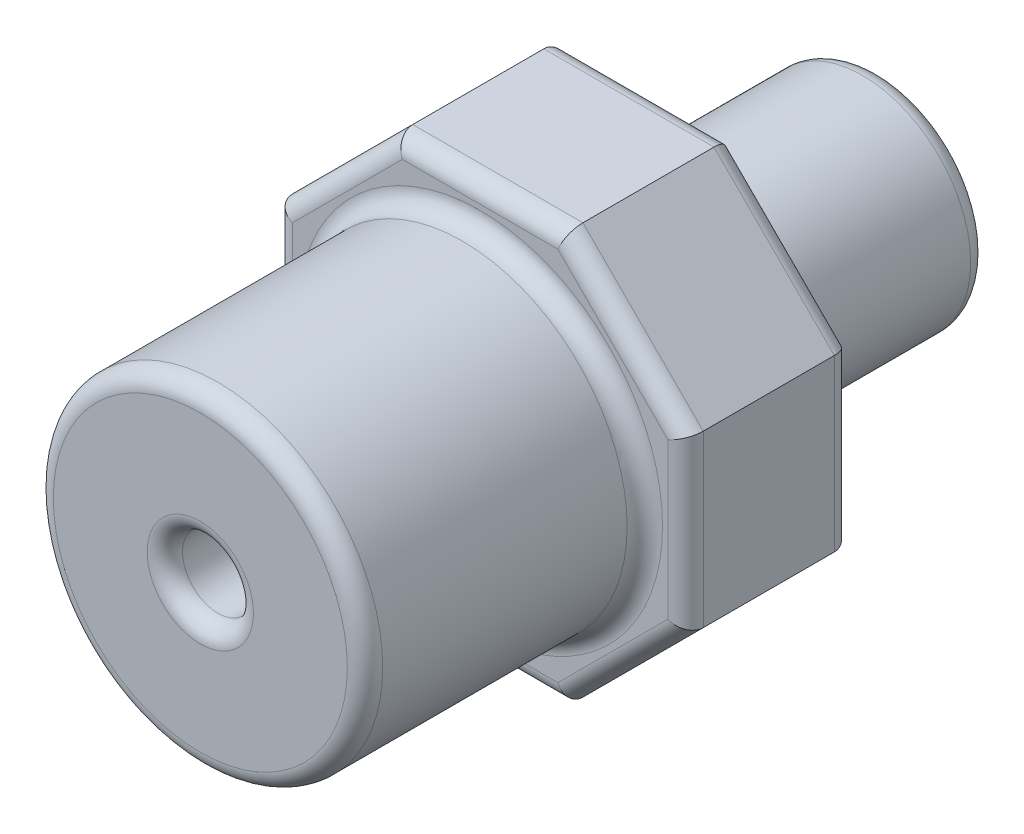
ISO-10303-21;
HEADER;
FILE_DESCRIPTION(('STEP AP214'),'2;1');
FILE_NAME('part.step','',(''),(''),'','','');
FILE_SCHEMA(('AUTOMOTIVE_DESIGN { 1 0 10303 214 1 1 1 1 }'));
ENDSEC;
DATA;
#1=APPLICATION_CONTEXT('core data for automotive mechanical design processes');
#2=APPLICATION_PROTOCOL_DEFINITION('international standard','automotive_design',2000,#1);
#3=PRODUCT_CONTEXT('',#1,'mechanical');
#4=PRODUCT('Part','Part','',(#3));
#5=PRODUCT_RELATED_PRODUCT_CATEGORY('part','',(#4));
#6=PRODUCT_DEFINITION_FORMATION('','',#4);
#7=PRODUCT_DEFINITION_CONTEXT('part definition',#1,'design');
#8=PRODUCT_DEFINITION('design','',#6,#7);
#9=PRODUCT_DEFINITION_SHAPE('','',#8);
#10=(LENGTH_UNIT() NAMED_UNIT(*) SI_UNIT(.MILLI.,.METRE.));
#11=(NAMED_UNIT(*) PLANE_ANGLE_UNIT() SI_UNIT($,.RADIAN.));
#12=(NAMED_UNIT(*) SI_UNIT($,.STERADIAN.) SOLID_ANGLE_UNIT());
#13=UNCERTAINTY_MEASURE_WITH_UNIT(LENGTH_MEASURE(1.E-05),#10,'distance_accuracy_value','');
#14=(GEOMETRIC_REPRESENTATION_CONTEXT(3) GLOBAL_UNCERTAINTY_ASSIGNED_CONTEXT((#13)) GLOBAL_UNIT_ASSIGNED_CONTEXT((#10,
#11,#12)) REPRESENTATION_CONTEXT('',''));
#15=CARTESIAN_POINT('',(0.,0.,0.));
#16=DIRECTION('',(0.,0.,1.));
#17=DIRECTION('',(1.,0.,0.));
#18=AXIS2_PLACEMENT_3D('',#15,#16,#17);
#19=CARTESIAN_POINT('',(0.,0.,0.));
#20=DIRECTION('',(0.,0.,1.));
#21=DIRECTION('',(1.,0.,0.));
#22=AXIS2_PLACEMENT_3D('',#19,#20,#21);
#23=PLANE('',#22);
#24=CARTESIAN_POINT('',(0.,0.,0.));
#25=DIRECTION('',(0.,0.,1.));
#26=DIRECTION('',(1.,0.,0.));
#27=AXIS2_PLACEMENT_3D('',#24,#25,#26);
#28=CIRCLE('',#27,1.5);
#29=CARTESIAN_POINT('',(1.5,0.,0.));
#30=VERTEX_POINT('',#29);
#31=EDGE_CURVE('E273',#30,#30,#28,.T.);
#32=ORIENTED_EDGE('',*,*,#31,.T.);
#33=EDGE_LOOP('',(#32));
#34=FACE_BOUND('',#33,.T.);
#35=CARTESIAN_POINT('',(0.,0.,0.));
#36=DIRECTION('',(0.,0.,1.));
#37=DIRECTION('',(1.,0.,0.));
#38=AXIS2_PLACEMENT_3D('',#35,#36,#37);
#39=CIRCLE('',#38,2.55);
#40=CARTESIAN_POINT('',(2.55,0.,0.));
#41=VERTEX_POINT('',#40);
#42=EDGE_CURVE('E269',#41,#41,#39,.F.);
#43=ORIENTED_EDGE('',*,*,#42,.T.);
#44=EDGE_LOOP('',(#43));
#45=FACE_BOUND('',#44,.T.);
#46=ADVANCED_FACE('F43',(#34,#45),#23,.F.);
#47=CARTESIAN_POINT('',(0.,0.,6.6));
#48=DIRECTION('',(0.,0.,-1.));
#49=DIRECTION('',(-1.,0.,0.));
#50=AXIS2_PLACEMENT_3D('',#47,#48,#49);
#51=CYLINDRICAL_SURFACE('',#50,3.05);
#52=CARTESIAN_POINT('',(0.,0.,0.5));
#53=DIRECTION('',(0.,0.,1.));
#54=DIRECTION('',(1.,0.,0.));
#55=AXIS2_PLACEMENT_3D('',#52,#53,#54);
#56=CIRCLE('',#55,3.05);
#57=CARTESIAN_POINT('',(3.05,0.,0.5));
#58=VERTEX_POINT('',#57);
#59=EDGE_CURVE('E11',#58,#58,#56,.T.);
#60=ORIENTED_EDGE('',*,*,#59,.T.);
#61=EDGE_LOOP('',(#60));
#62=FACE_BOUND('',#61,.T.);
#63=CARTESIAN_POINT('',(0.,0.,6.1));
#64=DIRECTION('',(0.,0.,1.));
#65=DIRECTION('',(1.,0.,0.));
#66=AXIS2_PLACEMENT_3D('',#63,#64,#65);
#67=CIRCLE('',#66,3.05);
#68=CARTESIAN_POINT('',(3.05,0.,6.1));
#69=VERTEX_POINT('',#68);
#70=EDGE_CURVE('E53',#69,#69,#67,.F.);
#71=ORIENTED_EDGE('',*,*,#70,.T.);
#72=EDGE_LOOP('',(#71));
#73=FACE_BOUND('',#72,.T.);
#74=ADVANCED_FACE('F482',(#62,#73),#51,.T.);
#75=CARTESIAN_POINT('',(0.,0.,6.6));
#76=DIRECTION('',(0.,0.,-1.));
#77=DIRECTION('',(-1.,0.,0.));
#78=AXIS2_PLACEMENT_3D('',#75,#76,#77);
#79=CYLINDRICAL_SURFACE('',#78,1.);
#80=CARTESIAN_POINT('',(0.,0.,18.7));
#81=DIRECTION('',(0.,0.,1.));
#82=DIRECTION('',(1.,0.,0.));
#83=AXIS2_PLACEMENT_3D('',#80,#81,#82);
#84=CIRCLE('',#83,1.);
#85=CARTESIAN_POINT('',(1.,0.,18.7));
#86=VERTEX_POINT('',#85);
#87=EDGE_CURVE('E378',#86,#86,#84,.T.);
#88=ORIENTED_EDGE('',*,*,#87,.T.);
#89=EDGE_LOOP('',(#88));
#90=FACE_BOUND('',#89,.T.);
#91=CARTESIAN_POINT('',(0.,0.,0.5));
#92=DIRECTION('',(0.,0.,1.));
#93=DIRECTION('',(1.,0.,0.));
#94=AXIS2_PLACEMENT_3D('',#91,#92,#93);
#95=CIRCLE('',#94,1.);
#96=CARTESIAN_POINT('',(1.,0.,0.5));
#97=VERTEX_POINT('',#96);
#98=EDGE_CURVE('E372',#97,#97,#95,.F.);
#99=ORIENTED_EDGE('',*,*,#98,.T.);
#100=EDGE_LOOP('',(#99));
#101=FACE_BOUND('',#100,.T.);
#102=ADVANCED_FACE('F488',(#90,#101),#79,.F.);
#103=CARTESIAN_POINT('',(0.,0.,11.3));
#104=DIRECTION('',(0.,0.,1.));
#105=DIRECTION('',(1.,0.,0.));
#106=AXIS2_PLACEMENT_3D('',#103,#104,#105);
#107=PLANE('',#106);
#108=DIRECTION('',(-0.707106781186547,0.707106781186548,0.));
#109=VECTOR('',#108,1.);
#110=CARTESIAN_POINT('',(2.04888527117068,5.44644660940672,11.3));
#111=LINE('',#110,#109);
#112=CARTESIAN_POINT('',(5.3,2.1953318805774,11.3));
#113=VERTEX_POINT('',#112);
#114=CARTESIAN_POINT('',(2.1953318805774,5.3,11.3));
#115=VERTEX_POINT('',#114);
#116=EDGE_CURVE('E186',#113,#115,#111,.T.);
#117=ORIENTED_EDGE('',*,*,#116,.T.);
#118=DIRECTION('',(-1.,0.,0.));
#119=VECTOR('',#118,1.);
#120=CARTESIAN_POINT('',(-2.40243866176395,5.3,11.3));
#121=LINE('',#120,#119);
#122=CARTESIAN_POINT('',(-2.1953318805774,5.3,11.3));
#123=VERTEX_POINT('',#122);
#124=EDGE_CURVE('E164',#115,#123,#121,.T.);
#125=ORIENTED_EDGE('',*,*,#124,.T.);
#126=DIRECTION('',(-0.707106781186547,-0.707106781186548,0.));
#127=VECTOR('',#126,1.);
#128=CARTESIAN_POINT('',(-5.44644660940672,2.04888527117068,11.3));
#129=LINE('',#128,#127);
#130=CARTESIAN_POINT('',(-5.3,2.1953318805774,11.3));
#131=VERTEX_POINT('',#130);
#132=EDGE_CURVE('E173',#123,#131,#129,.T.);
#133=ORIENTED_EDGE('',*,*,#132,.T.);
#134=DIRECTION('',(0.,-1.,0.));
#135=VECTOR('',#134,1.);
#136=CARTESIAN_POINT('',(-5.3,-2.40243866176395,11.3));
#137=LINE('',#136,#135);
#138=CARTESIAN_POINT('',(-5.3,-2.1953318805774,11.3));
#139=VERTEX_POINT('',#138);
#140=EDGE_CURVE('E180',#131,#139,#137,.T.);
#141=ORIENTED_EDGE('',*,*,#140,.T.);
#142=DIRECTION('',(0.707106781186547,-0.707106781186548,0.));
#143=VECTOR('',#142,1.);
#144=CARTESIAN_POINT('',(-2.04888527117068,-5.44644660940672,11.3));
#145=LINE('',#144,#143);
#146=CARTESIAN_POINT('',(-2.1953318805774,-5.3,11.3));
#147=VERTEX_POINT('',#146);
#148=EDGE_CURVE('E408',#139,#147,#145,.T.);
#149=ORIENTED_EDGE('',*,*,#148,.T.);
#150=DIRECTION('',(1.,0.,0.));
#151=VECTOR('',#150,1.);
#152=CARTESIAN_POINT('',(2.40243866176395,-5.3,11.3));
#153=LINE('',#152,#151);
#154=CARTESIAN_POINT('',(2.1953318805774,-5.3,11.3));
#155=VERTEX_POINT('',#154);
#156=EDGE_CURVE('E411',#147,#155,#153,.T.);
#157=ORIENTED_EDGE('',*,*,#156,.T.);
#158=DIRECTION('',(0.707106781186547,0.707106781186548,0.));
#159=VECTOR('',#158,1.);
#160=CARTESIAN_POINT('',(5.44644660940672,-2.04888527117068,11.3));
#161=LINE('',#160,#159);
#162=CARTESIAN_POINT('',(5.3,-2.1953318805774,11.3));
#163=VERTEX_POINT('',#162);
#164=EDGE_CURVE('E414',#155,#163,#161,.T.);
#165=ORIENTED_EDGE('',*,*,#164,.T.);
#166=DIRECTION('',(0.,1.,0.));
#167=VECTOR('',#166,1.);
#168=CARTESIAN_POINT('',(5.3,2.40243866176395,11.3));
#169=LINE('',#168,#167);
#170=EDGE_CURVE('E194',#163,#113,#169,.T.);
#171=ORIENTED_EDGE('',*,*,#170,.T.);
#172=EDGE_LOOP('',(#117,#125,#133,#141,#149,#157,#165,#171));
#173=FACE_BOUND('',#172,.T.);
#174=CARTESIAN_POINT('',(0.,0.,11.3));
#175=DIRECTION('',(0.,0.,1.));
#176=DIRECTION('',(1.,0.,0.));
#177=AXIS2_PLACEMENT_3D('',#174,#175,#176);
#178=CIRCLE('',#177,5.15);
#179=CARTESIAN_POINT('',(5.15,0.,11.3));
#180=VERTEX_POINT('',#179);
#181=EDGE_CURVE('E181',#180,#180,#178,.F.);
#182=ORIENTED_EDGE('',*,*,#181,.T.);
#183=EDGE_LOOP('',(#182));
#184=FACE_BOUND('',#183,.T.);
#185=ADVANCED_FACE('F183',(#173,#184),#107,.T.);
#186=CARTESIAN_POINT('',(0.,0.,6.6));
#187=DIRECTION('',(0.,0.,1.));
#188=DIRECTION('',(1.,0.,0.));
#189=AXIS2_PLACEMENT_3D('',#186,#187,#188);
#190=PLANE('',#189);
#191=DIRECTION('',(0.707106781186547,-0.707106781186548,0.));
#192=VECTOR('',#191,1.);
#193=CARTESIAN_POINT('',(-3.7476659402887,-3.7476659402887,6.6));
#194=LINE('',#193,#192);
#195=CARTESIAN_POINT('',(-2.1953318805774,-5.3,6.6));
#196=VERTEX_POINT('',#195);
#197=CARTESIAN_POINT('',(-5.3,-2.1953318805774,6.6));
#198=VERTEX_POINT('',#197);
#199=EDGE_CURVE('E61',#196,#198,#194,.F.);
#200=ORIENTED_EDGE('',*,*,#199,.T.);
#201=DIRECTION('',(0.,-1.,0.));
#202=VECTOR('',#201,1.);
#203=CARTESIAN_POINT('',(-5.3,0.,6.6));
#204=LINE('',#203,#202);
#205=CARTESIAN_POINT('',(-5.3,2.1953318805774,6.6));
#206=VERTEX_POINT('',#205);
#207=EDGE_CURVE('E266',#198,#206,#204,.F.);
#208=ORIENTED_EDGE('',*,*,#207,.T.);
#209=DIRECTION('',(-0.707106781186547,-0.707106781186548,0.));
#210=VECTOR('',#209,1.);
#211=CARTESIAN_POINT('',(-3.7476659402887,3.7476659402887,6.6));
#212=LINE('',#211,#210);
#213=CARTESIAN_POINT('',(-2.1953318805774,5.3,6.6));
#214=VERTEX_POINT('',#213);
#215=EDGE_CURVE('E247',#206,#214,#212,.F.);
#216=ORIENTED_EDGE('',*,*,#215,.T.);
#217=DIRECTION('',(-1.,0.,0.));
#218=VECTOR('',#217,1.);
#219=CARTESIAN_POINT('',(0.,5.3,6.6));
#220=LINE('',#219,#218);
#221=CARTESIAN_POINT('',(2.1953318805774,5.3,6.6));
#222=VERTEX_POINT('',#221);
#223=EDGE_CURVE('E250',#214,#222,#220,.F.);
#224=ORIENTED_EDGE('',*,*,#223,.T.);
#225=DIRECTION('',(-0.707106781186547,0.707106781186548,0.));
#226=VECTOR('',#225,1.);
#227=CARTESIAN_POINT('',(3.7476659402887,3.7476659402887,6.6));
#228=LINE('',#227,#226);
#229=CARTESIAN_POINT('',(5.3,2.1953318805774,6.6));
#230=VERTEX_POINT('',#229);
#231=EDGE_CURVE('E253',#222,#230,#228,.F.);
#232=ORIENTED_EDGE('',*,*,#231,.T.);
#233=DIRECTION('',(0.,1.,0.));
#234=VECTOR('',#233,1.);
#235=CARTESIAN_POINT('',(5.3,0.,6.6));
#236=LINE('',#235,#234);
#237=CARTESIAN_POINT('',(5.3,-2.1953318805774,6.6));
#238=VERTEX_POINT('',#237);
#239=EDGE_CURVE('E256',#230,#238,#236,.F.);
#240=ORIENTED_EDGE('',*,*,#239,.T.);
#241=DIRECTION('',(0.707106781186547,0.707106781186548,0.));
#242=VECTOR('',#241,1.);
#243=CARTESIAN_POINT('',(3.7476659402887,-3.7476659402887,6.6));
#244=LINE('',#243,#242);
#245=CARTESIAN_POINT('',(2.1953318805774,-5.3,6.6));
#246=VERTEX_POINT('',#245);
#247=EDGE_CURVE('E259',#238,#246,#244,.F.);
#248=ORIENTED_EDGE('',*,*,#247,.T.);
#249=DIRECTION('',(1.,0.,0.));
#250=VECTOR('',#249,1.);
#251=CARTESIAN_POINT('',(0.,-5.3,6.6));
#252=LINE('',#251,#250);
#253=EDGE_CURVE('E66',#246,#196,#252,.F.);
#254=ORIENTED_EDGE('',*,*,#253,.T.);
#255=EDGE_LOOP('',(#200,#208,#216,#224,#232,#240,#248,#254));
#256=FACE_BOUND('',#255,.T.);
#257=CARTESIAN_POINT('',(0.,0.,6.6));
#258=DIRECTION('',(0.,0.,1.));
#259=DIRECTION('',(1.,0.,0.));
#260=AXIS2_PLACEMENT_3D('',#257,#258,#259);
#261=CIRCLE('',#260,3.55);
#262=CARTESIAN_POINT('',(3.55,0.,6.6));
#263=VERTEX_POINT('',#262);
#264=EDGE_CURVE('E243',#263,#263,#261,.T.);
#265=ORIENTED_EDGE('',*,*,#264,.T.);
#266=EDGE_LOOP('',(#265));
#267=FACE_BOUND('',#266,.T.);
#268=ADVANCED_FACE('F345',(#256,#267),#190,.F.);
#269=CARTESIAN_POINT('',(-5.8,2.40243866176395,11.3));
#270=DIRECTION('',(0.707106781186548,-0.707106781186547,0.));
#271=DIRECTION('',(0.707106781186547,0.707106781186548,0.));
#272=AXIS2_PLACEMENT_3D('',#269,#270,#271);
#273=PLANE('',#272);
#274=DIRECTION('',(0.,0.,-1.));
#275=VECTOR('',#274,1.);
#276=CARTESIAN_POINT('',(-5.8,2.40243866176395,11.3));
#277=LINE('',#276,#275);
#278=CARTESIAN_POINT('',(-5.8,2.40243866176395,10.8));
#279=VERTEX_POINT('',#278);
#280=CARTESIAN_POINT('',(-5.8,2.40243866176395,7.1));
#281=VERTEX_POINT('',#280);
#282=EDGE_CURVE('E364',#279,#281,#277,.T.);
#283=ORIENTED_EDGE('',*,*,#282,.F.);
#284=DIRECTION('',(-0.707106781186547,-0.707106781186548,0.));
#285=VECTOR('',#284,1.);
#286=CARTESIAN_POINT('',(-2.40243866176395,5.8,10.8));
#287=LINE('',#286,#285);
#288=CARTESIAN_POINT('',(-2.40243866176395,5.8,10.8));
#289=VERTEX_POINT('',#288);
#290=EDGE_CURVE('E240',#279,#289,#287,.F.);
#291=ORIENTED_EDGE('',*,*,#290,.T.);
#292=DIRECTION('',(0.,0.,-1.));
#293=VECTOR('',#292,1.);
#294=CARTESIAN_POINT('',(-2.40243866176395,5.8,11.3));
#295=LINE('',#294,#293);
#296=CARTESIAN_POINT('',(-2.40243866176395,5.8,7.1));
#297=VERTEX_POINT('',#296);
#298=EDGE_CURVE('E304',#289,#297,#295,.T.);
#299=ORIENTED_EDGE('',*,*,#298,.T.);
#300=DIRECTION('',(-0.707106781186547,-0.707106781186548,0.));
#301=VECTOR('',#300,1.);
#302=CARTESIAN_POINT('',(-5.8,2.40243866176395,7.1));
#303=LINE('',#302,#301);
#304=EDGE_CURVE('E237',#297,#281,#303,.T.);
#305=ORIENTED_EDGE('',*,*,#304,.T.);
#306=EDGE_LOOP('',(#283,#291,#299,#305));
#307=FACE_BOUND('',#306,.T.);
#308=ADVANCED_FACE('F363',(#307),#273,.F.);
#309=CARTESIAN_POINT('',(-5.8,-2.40243866176395,11.3));
#310=DIRECTION('',(1.,0.,0.));
#311=DIRECTION('',(0.,0.,-1.));
#312=AXIS2_PLACEMENT_3D('',#309,#310,#311);
#313=PLANE('',#312);
#314=DIRECTION('',(0.,0.,-1.));
#315=VECTOR('',#314,1.);
#316=CARTESIAN_POINT('',(-5.8,-2.40243866176395,11.3));
#317=LINE('',#316,#315);
#318=CARTESIAN_POINT('',(-5.8,-2.40243866176395,10.8));
#319=VERTEX_POINT('',#318);
#320=CARTESIAN_POINT('',(-5.8,-2.40243866176395,7.1));
#321=VERTEX_POINT('',#320);
#322=EDGE_CURVE('E373',#319,#321,#317,.T.);
#323=ORIENTED_EDGE('',*,*,#322,.F.);
#324=DIRECTION('',(0.,-1.,0.));
#325=VECTOR('',#324,1.);
#326=CARTESIAN_POINT('',(-5.8,2.40243866176395,10.8));
#327=LINE('',#326,#325);
#328=EDGE_CURVE('E234',#319,#279,#327,.F.);
#329=ORIENTED_EDGE('',*,*,#328,.T.);
#330=ORIENTED_EDGE('',*,*,#282,.T.);
#331=DIRECTION('',(0.,-1.,0.));
#332=VECTOR('',#331,1.);
#333=CARTESIAN_POINT('',(-5.8,-2.40243866176395,7.1));
#334=LINE('',#333,#332);
#335=EDGE_CURVE('E230',#281,#321,#334,.T.);
#336=ORIENTED_EDGE('',*,*,#335,.T.);
#337=EDGE_LOOP('',(#323,#329,#330,#336));
#338=FACE_BOUND('',#337,.T.);
#339=ADVANCED_FACE('F368',(#338),#313,.F.);
#340=CARTESIAN_POINT('',(-5.8,-2.40243866176395,11.3));
#341=DIRECTION('',(0.707106781186548,0.707106781186547,0.));
#342=DIRECTION('',(-0.707106781186547,0.707106781186548,0.));
#343=AXIS2_PLACEMENT_3D('',#340,#341,#342);
#344=PLANE('',#343);
#345=DIRECTION('',(0.,0.,-1.));
#346=VECTOR('',#345,1.);
#347=CARTESIAN_POINT('',(-2.40243866176395,-5.8,11.3));
#348=LINE('',#347,#346);
#349=CARTESIAN_POINT('',(-2.40243866176395,-5.8,10.8));
#350=VERTEX_POINT('',#349);
#351=CARTESIAN_POINT('',(-2.40243866176395,-5.8,7.1));
#352=VERTEX_POINT('',#351);
#353=EDGE_CURVE('E380',#350,#352,#348,.T.);
#354=ORIENTED_EDGE('',*,*,#353,.F.);
#355=DIRECTION('',(0.707106781186547,-0.707106781186548,0.));
#356=VECTOR('',#355,1.);
#357=CARTESIAN_POINT('',(-5.8,-2.40243866176395,10.8));
#358=LINE('',#357,#356);
#359=EDGE_CURVE('E227',#350,#319,#358,.F.);
#360=ORIENTED_EDGE('',*,*,#359,.T.);
#361=ORIENTED_EDGE('',*,*,#322,.T.);
#362=DIRECTION('',(0.707106781186547,-0.707106781186548,0.));
#363=VECTOR('',#362,1.);
#364=CARTESIAN_POINT('',(-5.8,-2.40243866176395,7.1));
#365=LINE('',#364,#363);
#366=EDGE_CURVE('E224',#321,#352,#365,.T.);
#367=ORIENTED_EDGE('',*,*,#366,.T.);
#368=EDGE_LOOP('',(#354,#360,#361,#367));
#369=FACE_BOUND('',#368,.T.);
#370=ADVANCED_FACE('F566',(#369),#344,.F.);
#371=CARTESIAN_POINT('',(2.40243866176395,-5.8,11.3));
#372=DIRECTION('',(0.,1.,0.));
#373=DIRECTION('',(0.,0.,1.));
#374=AXIS2_PLACEMENT_3D('',#371,#372,#373);
#375=PLANE('',#374);
#376=DIRECTION('',(0.,0.,-1.));
#377=VECTOR('',#376,1.);
#378=CARTESIAN_POINT('',(2.40243866176395,-5.8,11.3));
#379=LINE('',#378,#377);
#380=CARTESIAN_POINT('',(2.40243866176395,-5.8,10.8));
#381=VERTEX_POINT('',#380);
#382=CARTESIAN_POINT('',(2.40243866176395,-5.8,7.1));
#383=VERTEX_POINT('',#382);
#384=EDGE_CURVE('E448',#381,#383,#379,.T.);
#385=ORIENTED_EDGE('',*,*,#384,.F.);
#386=DIRECTION('',(1.,0.,0.));
#387=VECTOR('',#386,1.);
#388=CARTESIAN_POINT('',(-2.40243866176395,-5.8,10.8));
#389=LINE('',#388,#387);
#390=EDGE_CURVE('E221',#381,#350,#389,.F.);
#391=ORIENTED_EDGE('',*,*,#390,.T.);
#392=ORIENTED_EDGE('',*,*,#353,.T.);
#393=DIRECTION('',(1.,0.,0.));
#394=VECTOR('',#393,1.);
#395=CARTESIAN_POINT('',(2.40243866176395,-5.8,7.1));
#396=LINE('',#395,#394);
#397=EDGE_CURVE('E218',#352,#383,#396,.T.);
#398=ORIENTED_EDGE('',*,*,#397,.T.);
#399=EDGE_LOOP('',(#385,#391,#392,#398));
#400=FACE_BOUND('',#399,.T.);
#401=ADVANCED_FACE('F457',(#400),#375,.F.);
#402=CARTESIAN_POINT('',(5.8,-2.40243866176395,11.3));
#403=DIRECTION('',(-0.707106781186548,0.707106781186547,0.));
#404=DIRECTION('',(-0.707106781186547,-0.707106781186548,0.));
#405=AXIS2_PLACEMENT_3D('',#402,#403,#404);
#406=PLANE('',#405);
#407=DIRECTION('',(0.,0.,-1.));
#408=VECTOR('',#407,1.);
#409=CARTESIAN_POINT('',(5.8,-2.40243866176395,11.3));
#410=LINE('',#409,#408);
#411=CARTESIAN_POINT('',(5.8,-2.40243866176395,10.8));
#412=VERTEX_POINT('',#411);
#413=CARTESIAN_POINT('',(5.8,-2.40243866176395,7.1));
#414=VERTEX_POINT('',#413);
#415=EDGE_CURVE('E441',#412,#414,#410,.T.);
#416=ORIENTED_EDGE('',*,*,#415,.F.);
#417=DIRECTION('',(0.707106781186547,0.707106781186548,0.));
#418=VECTOR('',#417,1.);
#419=CARTESIAN_POINT('',(2.40243866176395,-5.8,10.8));
#420=LINE('',#419,#418);
#421=EDGE_CURVE('E215',#412,#381,#420,.F.);
#422=ORIENTED_EDGE('',*,*,#421,.T.);
#423=ORIENTED_EDGE('',*,*,#384,.T.);
#424=DIRECTION('',(0.707106781186547,0.707106781186548,0.));
#425=VECTOR('',#424,1.);
#426=CARTESIAN_POINT('',(5.8,-2.40243866176395,7.1));
#427=LINE('',#426,#425);
#428=EDGE_CURVE('E212',#383,#414,#427,.T.);
#429=ORIENTED_EDGE('',*,*,#428,.T.);
#430=EDGE_LOOP('',(#416,#422,#423,#429));
#431=FACE_BOUND('',#430,.T.);
#432=ADVANCED_FACE('F559',(#431),#406,.F.);
#433=CARTESIAN_POINT('',(5.8,-2.40243866176395,11.3));
#434=DIRECTION('',(-1.,0.,0.));
#435=DIRECTION('',(0.,0.,1.));
#436=AXIS2_PLACEMENT_3D('',#433,#434,#435);
#437=PLANE('',#436);
#438=DIRECTION('',(0.,0.,-1.));
#439=VECTOR('',#438,1.);
#440=CARTESIAN_POINT('',(5.8,2.40243866176395,11.3));
#441=LINE('',#440,#439);
#442=CARTESIAN_POINT('',(5.8,2.40243866176395,10.8));
#443=VERTEX_POINT('',#442);
#444=CARTESIAN_POINT('',(5.8,2.40243866176395,7.1));
#445=VERTEX_POINT('',#444);
#446=EDGE_CURVE('E437',#443,#445,#441,.T.);
#447=ORIENTED_EDGE('',*,*,#446,.F.);
#448=DIRECTION('',(0.,1.,0.));
#449=VECTOR('',#448,1.);
#450=CARTESIAN_POINT('',(5.8,-2.40243866176395,10.8));
#451=LINE('',#450,#449);
#452=EDGE_CURVE('E209',#443,#412,#451,.F.);
#453=ORIENTED_EDGE('',*,*,#452,.T.);
#454=ORIENTED_EDGE('',*,*,#415,.T.);
#455=DIRECTION('',(0.,1.,0.));
#456=VECTOR('',#455,1.);
#457=CARTESIAN_POINT('',(5.8,-2.40243866176395,7.1));
#458=LINE('',#457,#456);
#459=EDGE_CURVE('E206',#414,#445,#458,.T.);
#460=ORIENTED_EDGE('',*,*,#459,.T.);
#461=EDGE_LOOP('',(#447,#453,#454,#460));
#462=FACE_BOUND('',#461,.T.);
#463=ADVANCED_FACE('F556',(#462),#437,.F.);
#464=CARTESIAN_POINT('',(5.8,2.40243866176395,11.3));
#465=DIRECTION('',(-0.707106781186548,-0.707106781186547,0.));
#466=DIRECTION('',(0.707106781186547,-0.707106781186548,0.));
#467=AXIS2_PLACEMENT_3D('',#464,#465,#466);
#468=PLANE('',#467);
#469=DIRECTION('',(0.,0.,-1.));
#470=VECTOR('',#469,1.);
#471=CARTESIAN_POINT('',(2.40243866176395,5.8,11.3));
#472=LINE('',#471,#470);
#473=CARTESIAN_POINT('',(2.40243866176395,5.8,10.8));
#474=VERTEX_POINT('',#473);
#475=CARTESIAN_POINT('',(2.40243866176395,5.8,7.1));
#476=VERTEX_POINT('',#475);
#477=EDGE_CURVE('E434',#474,#476,#472,.T.);
#478=ORIENTED_EDGE('',*,*,#477,.F.);
#479=DIRECTION('',(-0.707106781186547,0.707106781186548,0.));
#480=VECTOR('',#479,1.);
#481=CARTESIAN_POINT('',(5.8,2.40243866176395,10.8));
#482=LINE('',#481,#480);
#483=EDGE_CURVE('E203',#474,#443,#482,.F.);
#484=ORIENTED_EDGE('',*,*,#483,.T.);
#485=ORIENTED_EDGE('',*,*,#446,.T.);
#486=DIRECTION('',(-0.707106781186547,0.707106781186548,0.));
#487=VECTOR('',#486,1.);
#488=CARTESIAN_POINT('',(5.8,2.40243866176395,7.1));
#489=LINE('',#488,#487);
#490=EDGE_CURVE('E200',#445,#476,#489,.T.);
#491=ORIENTED_EDGE('',*,*,#490,.T.);
#492=EDGE_LOOP('',(#478,#484,#485,#491));
#493=FACE_BOUND('',#492,.T.);
#494=ADVANCED_FACE('F435',(#493),#468,.F.);
#495=CARTESIAN_POINT('',(2.40243866176395,5.8,11.3));
#496=DIRECTION('',(0.,-1.,0.));
#497=DIRECTION('',(0.,0.,-1.));
#498=AXIS2_PLACEMENT_3D('',#495,#496,#497);
#499=PLANE('',#498);
#500=ORIENTED_EDGE('',*,*,#298,.F.);
#501=DIRECTION('',(-1.,0.,0.));
#502=VECTOR('',#501,1.);
#503=CARTESIAN_POINT('',(2.40243866176395,5.8,10.8));
#504=LINE('',#503,#502);
#505=EDGE_CURVE('E166',#289,#474,#504,.F.);
#506=ORIENTED_EDGE('',*,*,#505,.T.);
#507=ORIENTED_EDGE('',*,*,#477,.T.);
#508=DIRECTION('',(-1.,0.,0.));
#509=VECTOR('',#508,1.);
#510=CARTESIAN_POINT('',(2.40243866176395,5.8,7.1));
#511=LINE('',#510,#509);
#512=EDGE_CURVE('E189',#476,#297,#511,.T.);
#513=ORIENTED_EDGE('',*,*,#512,.T.);
#514=EDGE_LOOP('',(#500,#506,#507,#513));
#515=FACE_BOUND('',#514,.T.);
#516=ADVANCED_FACE('F433',(#515),#499,.F.);
#517=CARTESIAN_POINT('',(0.,0.,19.2));
#518=DIRECTION('',(0.,0.,1.));
#519=DIRECTION('',(1.,0.,0.));
#520=AXIS2_PLACEMENT_3D('',#517,#518,#519);
#521=PLANE('',#520);
#522=CARTESIAN_POINT('',(0.,0.,19.2));
#523=DIRECTION('',(0.,0.,1.));
#524=DIRECTION('',(1.,0.,0.));
#525=AXIS2_PLACEMENT_3D('',#522,#523,#524);
#526=CIRCLE('',#525,1.5);
#527=CARTESIAN_POINT('',(1.5,0.,19.2));
#528=VERTEX_POINT('',#527);
#529=EDGE_CURVE('E391',#528,#528,#526,.F.);
#530=ORIENTED_EDGE('',*,*,#529,.T.);
#531=EDGE_LOOP('',(#530));
#532=FACE_BOUND('',#531,.T.);
#533=CARTESIAN_POINT('',(0.,0.,19.2));
#534=DIRECTION('',(0.,0.,1.));
#535=DIRECTION('',(1.,0.,0.));
#536=AXIS2_PLACEMENT_3D('',#533,#534,#535);
#537=CIRCLE('',#536,4.15);
#538=CARTESIAN_POINT('',(4.15,0.,19.2));
#539=VERTEX_POINT('',#538);
#540=EDGE_CURVE('E387',#539,#539,#537,.T.);
#541=ORIENTED_EDGE('',*,*,#540,.T.);
#542=EDGE_LOOP('',(#541));
#543=FACE_BOUND('',#542,.T.);
#544=ADVANCED_FACE('F539',(#532,#543),#521,.T.);
#545=CARTESIAN_POINT('',(0.,0.,19.2));
#546=DIRECTION('',(0.,0.,-1.));
#547=DIRECTION('',(-1.,0.,0.));
#548=AXIS2_PLACEMENT_3D('',#545,#546,#547);
#549=CYLINDRICAL_SURFACE('',#548,4.65);
#550=CARTESIAN_POINT('',(0.,0.,18.7));
#551=DIRECTION('',(0.,0.,1.));
#552=DIRECTION('',(1.,0.,0.));
#553=AXIS2_PLACEMENT_3D('',#550,#551,#552);
#554=CIRCLE('',#553,4.65);
#555=CARTESIAN_POINT('',(4.65,0.,18.7));
#556=VERTEX_POINT('',#555);
#557=EDGE_CURVE('E399',#556,#556,#554,.F.);
#558=ORIENTED_EDGE('',*,*,#557,.T.);
#559=EDGE_LOOP('',(#558));
#560=FACE_BOUND('',#559,.T.);
#561=CARTESIAN_POINT('',(0.,0.,11.8));
#562=DIRECTION('',(0.,0.,1.));
#563=DIRECTION('',(1.,0.,0.));
#564=AXIS2_PLACEMENT_3D('',#561,#562,#563);
#565=CIRCLE('',#564,4.65);
#566=CARTESIAN_POINT('',(4.65,0.,11.8));
#567=VERTEX_POINT('',#566);
#568=EDGE_CURVE('E395',#567,#567,#565,.T.);
#569=ORIENTED_EDGE('',*,*,#568,.T.);
#570=EDGE_LOOP('',(#569));
#571=FACE_BOUND('',#570,.T.);
#572=ADVANCED_FACE('F499',(#560,#571),#549,.T.);
#573=CARTESIAN_POINT('',(0.,0.,18.7));
#574=DIRECTION('',(0.,0.,1.));
#575=DIRECTION('',(1.,0.,0.));
#576=AXIS2_PLACEMENT_3D('',#573,#574,#575);
#577=TOROIDAL_SURFACE('',#576,1.5,0.5);
#578=ORIENTED_EDGE('',*,*,#529,.F.);
#579=EDGE_LOOP('',(#578));
#580=FACE_BOUND('',#579,.T.);
#581=ORIENTED_EDGE('',*,*,#87,.F.);
#582=EDGE_LOOP('',(#581));
#583=FACE_BOUND('',#582,.T.);
#584=ADVANCED_FACE('F495',(#580,#583),#577,.T.);
#585=CARTESIAN_POINT('',(0.,0.,18.7));
#586=DIRECTION('',(0.,0.,1.));
#587=DIRECTION('',(1.,0.,0.));
#588=AXIS2_PLACEMENT_3D('',#585,#586,#587);
#589=TOROIDAL_SURFACE('',#588,4.15,0.5);
#590=ORIENTED_EDGE('',*,*,#557,.F.);
#591=EDGE_LOOP('',(#590));
#592=FACE_BOUND('',#591,.T.);
#593=ORIENTED_EDGE('',*,*,#540,.F.);
#594=EDGE_LOOP('',(#593));
#595=FACE_BOUND('',#594,.T.);
#596=ADVANCED_FACE('F498',(#592,#595),#589,.T.);
#597=CARTESIAN_POINT('',(0.,-5.3,10.8));
#598=DIRECTION('',(-1.,0.,0.));
#599=DIRECTION('',(0.,0.,1.));
#600=AXIS2_PLACEMENT_3D('',#597,#598,#599);
#601=CYLINDRICAL_SURFACE('',#600,0.5);
#602=CARTESIAN_POINT('',(-2.1953318805774,-5.3,10.8));
#603=DIRECTION('',(-0.923879532511287,0.38268343236509,0.));
#604=DIRECTION('',(0.38268343236509,0.923879532511287,0.));
#605=AXIS2_PLACEMENT_3D('',#602,#603,#604);
#606=ELLIPSE('',#605,0.541196100146197,0.5);
#607=EDGE_CURVE('E296',#350,#147,#606,.T.);
#608=ORIENTED_EDGE('',*,*,#607,.F.);
#609=ORIENTED_EDGE('',*,*,#390,.F.);
#610=CARTESIAN_POINT('',(2.1953318805774,-5.3,10.8));
#611=DIRECTION('',(-0.923879532511287,-0.38268343236509,0.));
#612=DIRECTION('',(-0.38268343236509,0.923879532511287,0.));
#613=AXIS2_PLACEMENT_3D('',#610,#611,#612);
#614=ELLIPSE('',#613,0.541196100146197,0.5);
#615=EDGE_CURVE('E300',#155,#381,#614,.F.);
#616=ORIENTED_EDGE('',*,*,#615,.F.);
#617=ORIENTED_EDGE('',*,*,#156,.F.);
#618=EDGE_LOOP('',(#608,#609,#616,#617));
#619=FACE_BOUND('',#618,.T.);
#620=ADVANCED_FACE('F503',(#619),#601,.T.);
#621=CARTESIAN_POINT('',(3.7476659402887,-3.7476659402887,10.8));
#622=DIRECTION('',(-0.707106781186547,-0.707106781186548,0.));
#623=DIRECTION('',(0.707106781186548,-0.707106781186547,0.));
#624=AXIS2_PLACEMENT_3D('',#621,#622,#623);
#625=CYLINDRICAL_SURFACE('',#624,0.5);
#626=ORIENTED_EDGE('',*,*,#615,.T.);
#627=ORIENTED_EDGE('',*,*,#421,.F.);
#628=CARTESIAN_POINT('',(5.3,-2.1953318805774,10.8));
#629=DIRECTION('',(-0.38268343236509,-0.923879532511287,0.));
#630=DIRECTION('',(-0.923879532511287,0.38268343236509,0.));
#631=AXIS2_PLACEMENT_3D('',#628,#629,#630);
#632=ELLIPSE('',#631,0.541196100146197,0.5);
#633=EDGE_CURVE('E292',#163,#412,#632,.F.);
#634=ORIENTED_EDGE('',*,*,#633,.F.);
#635=ORIENTED_EDGE('',*,*,#164,.F.);
#636=EDGE_LOOP('',(#626,#627,#634,#635));
#637=FACE_BOUND('',#636,.T.);
#638=ADVANCED_FACE('F521',(#637),#625,.T.);
#639=CARTESIAN_POINT('',(-3.7476659402887,-3.7476659402887,10.8));
#640=DIRECTION('',(-0.707106781186547,0.707106781186548,0.));
#641=DIRECTION('',(-0.707106781186548,-0.707106781186547,0.));
#642=AXIS2_PLACEMENT_3D('',#639,#640,#641);
#643=CYLINDRICAL_SURFACE('',#642,0.5);
#644=ORIENTED_EDGE('',*,*,#607,.T.);
#645=ORIENTED_EDGE('',*,*,#148,.F.);
#646=CARTESIAN_POINT('',(-5.3,-2.1953318805774,10.8));
#647=DIRECTION('',(-0.38268343236509,0.923879532511287,0.));
#648=DIRECTION('',(0.923879532511287,0.38268343236509,0.));
#649=AXIS2_PLACEMENT_3D('',#646,#647,#648);
#650=ELLIPSE('',#649,0.541196100146197,0.5);
#651=EDGE_CURVE('E288',#319,#139,#650,.T.);
#652=ORIENTED_EDGE('',*,*,#651,.F.);
#653=ORIENTED_EDGE('',*,*,#359,.F.);
#654=EDGE_LOOP('',(#644,#645,#652,#653));
#655=FACE_BOUND('',#654,.T.);
#656=ADVANCED_FACE('F518',(#655),#643,.T.);
#657=CARTESIAN_POINT('',(5.3,0.,10.8));
#658=DIRECTION('',(0.,-1.,0.));
#659=DIRECTION('',(0.,0.,-1.));
#660=AXIS2_PLACEMENT_3D('',#657,#658,#659);
#661=CYLINDRICAL_SURFACE('',#660,0.5);
#662=ORIENTED_EDGE('',*,*,#633,.T.);
#663=ORIENTED_EDGE('',*,*,#452,.F.);
#664=CARTESIAN_POINT('',(5.3,2.1953318805774,10.8));
#665=DIRECTION('',(0.38268343236509,-0.923879532511287,0.));
#666=DIRECTION('',(-0.923879532511287,-0.38268343236509,0.));
#667=AXIS2_PLACEMENT_3D('',#664,#665,#666);
#668=ELLIPSE('',#667,0.541196100146197,0.5);
#669=EDGE_CURVE('E284',#113,#443,#668,.F.);
#670=ORIENTED_EDGE('',*,*,#669,.F.);
#671=ORIENTED_EDGE('',*,*,#170,.F.);
#672=EDGE_LOOP('',(#662,#663,#670,#671));
#673=FACE_BOUND('',#672,.T.);
#674=ADVANCED_FACE('F423',(#673),#661,.T.);
#675=CARTESIAN_POINT('',(-5.3,0.,10.8));
#676=DIRECTION('',(0.,1.,0.));
#677=DIRECTION('',(0.,0.,1.));
#678=AXIS2_PLACEMENT_3D('',#675,#676,#677);
#679=CYLINDRICAL_SURFACE('',#678,0.5);
#680=ORIENTED_EDGE('',*,*,#651,.T.);
#681=ORIENTED_EDGE('',*,*,#140,.F.);
#682=CARTESIAN_POINT('',(-5.3,2.1953318805774,10.8));
#683=DIRECTION('',(0.38268343236509,0.923879532511287,0.));
#684=DIRECTION('',(0.923879532511287,-0.38268343236509,0.));
#685=AXIS2_PLACEMENT_3D('',#682,#683,#684);
#686=ELLIPSE('',#685,0.541196100146197,0.5);
#687=EDGE_CURVE('E176',#279,#131,#686,.T.);
#688=ORIENTED_EDGE('',*,*,#687,.F.);
#689=ORIENTED_EDGE('',*,*,#328,.F.);
#690=EDGE_LOOP('',(#680,#681,#688,#689));
#691=FACE_BOUND('',#690,.T.);
#692=ADVANCED_FACE('F512',(#691),#679,.T.);
#693=CARTESIAN_POINT('',(3.7476659402887,3.7476659402887,10.8));
#694=DIRECTION('',(0.707106781186547,-0.707106781186548,0.));
#695=DIRECTION('',(0.707106781186548,0.707106781186547,0.));
#696=AXIS2_PLACEMENT_3D('',#693,#694,#695);
#697=CYLINDRICAL_SURFACE('',#696,0.5);
#698=ORIENTED_EDGE('',*,*,#669,.T.);
#699=ORIENTED_EDGE('',*,*,#483,.F.);
#700=CARTESIAN_POINT('',(2.1953318805774,5.3,10.8));
#701=DIRECTION('',(0.923879532511287,-0.38268343236509,0.));
#702=DIRECTION('',(-0.38268343236509,-0.923879532511287,0.));
#703=AXIS2_PLACEMENT_3D('',#700,#701,#702);
#704=ELLIPSE('',#703,0.541196100146197,0.5);
#705=EDGE_CURVE('E170',#115,#474,#704,.F.);
#706=ORIENTED_EDGE('',*,*,#705,.F.);
#707=ORIENTED_EDGE('',*,*,#116,.F.);
#708=EDGE_LOOP('',(#698,#699,#706,#707));
#709=FACE_BOUND('',#708,.T.);
#710=ADVANCED_FACE('F426',(#709),#697,.T.);
#711=CARTESIAN_POINT('',(-3.7476659402887,3.7476659402887,10.8));
#712=DIRECTION('',(0.707106781186547,0.707106781186548,0.));
#713=DIRECTION('',(-0.707106781186548,0.707106781186547,0.));
#714=AXIS2_PLACEMENT_3D('',#711,#712,#713);
#715=CYLINDRICAL_SURFACE('',#714,0.5);
#716=ORIENTED_EDGE('',*,*,#687,.T.);
#717=ORIENTED_EDGE('',*,*,#132,.F.);
#718=CARTESIAN_POINT('',(-2.1953318805774,5.3,10.8));
#719=DIRECTION('',(0.923879532511287,0.38268343236509,0.));
#720=DIRECTION('',(-0.38268343236509,0.923879532511287,0.));
#721=AXIS2_PLACEMENT_3D('',#718,#719,#720);
#722=ELLIPSE('',#721,0.541196100146197,0.5);
#723=EDGE_CURVE('E160',#289,#123,#722,.T.);
#724=ORIENTED_EDGE('',*,*,#723,.F.);
#725=ORIENTED_EDGE('',*,*,#290,.F.);
#726=EDGE_LOOP('',(#716,#717,#724,#725));
#727=FACE_BOUND('',#726,.T.);
#728=ADVANCED_FACE('F174',(#727),#715,.T.);
#729=CARTESIAN_POINT('',(0.,5.3,10.8));
#730=DIRECTION('',(1.,0.,0.));
#731=DIRECTION('',(0.,0.,-1.));
#732=AXIS2_PLACEMENT_3D('',#729,#730,#731);
#733=CYLINDRICAL_SURFACE('',#732,0.5);
#734=ORIENTED_EDGE('',*,*,#705,.T.);
#735=ORIENTED_EDGE('',*,*,#505,.F.);
#736=ORIENTED_EDGE('',*,*,#723,.T.);
#737=ORIENTED_EDGE('',*,*,#124,.F.);
#738=EDGE_LOOP('',(#734,#735,#736,#737));
#739=FACE_BOUND('',#738,.T.);
#740=ADVANCED_FACE('F162',(#739),#733,.T.);
#741=CARTESIAN_POINT('',(0.,0.,11.8));
#742=DIRECTION('',(0.,0.,1.));
#743=DIRECTION('',(1.,0.,0.));
#744=AXIS2_PLACEMENT_3D('',#741,#742,#743);
#745=TOROIDAL_SURFACE('',#744,5.15,0.5);
#746=ORIENTED_EDGE('',*,*,#181,.F.);
#747=EDGE_LOOP('',(#746));
#748=FACE_BOUND('',#747,.T.);
#749=ORIENTED_EDGE('',*,*,#568,.F.);
#750=EDGE_LOOP('',(#749));
#751=FACE_BOUND('',#750,.T.);
#752=ADVANCED_FACE('F507',(#748,#751),#745,.F.);
#753=CARTESIAN_POINT('',(5.3,-2.40243866176395,7.1));
#754=DIRECTION('',(0.,1.,0.));
#755=DIRECTION('',(0.,0.,1.));
#756=AXIS2_PLACEMENT_3D('',#753,#754,#755);
#757=CYLINDRICAL_SURFACE('',#756,0.5);
#758=CARTESIAN_POINT('',(5.3,-2.1953318805774,7.1));
#759=DIRECTION('',(0.38268343236509,0.923879532511287,0.));
#760=DIRECTION('',(-0.923879532511287,0.38268343236509,0.));
#761=AXIS2_PLACEMENT_3D('',#758,#759,#760);
#762=ELLIPSE('',#761,0.541196100146197,0.5);
#763=EDGE_CURVE('E326',#238,#414,#762,.F.);
#764=ORIENTED_EDGE('',*,*,#763,.F.);
#765=ORIENTED_EDGE('',*,*,#239,.F.);
#766=CARTESIAN_POINT('',(5.3,2.1953318805774,7.1));
#767=DIRECTION('',(-0.38268343236509,0.923879532511287,0.));
#768=DIRECTION('',(-0.923879532511287,-0.38268343236509,0.));
#769=AXIS2_PLACEMENT_3D('',#766,#767,#768);
#770=ELLIPSE('',#769,0.541196100146197,0.5);
#771=EDGE_CURVE('E47',#445,#230,#770,.T.);
#772=ORIENTED_EDGE('',*,*,#771,.F.);
#773=ORIENTED_EDGE('',*,*,#459,.F.);
#774=EDGE_LOOP('',(#764,#765,#772,#773));
#775=FACE_BOUND('',#774,.T.);
#776=ADVANCED_FACE('F344',(#775),#757,.T.);
#777=CARTESIAN_POINT('',(5.44644660940672,2.04888527117068,7.1));
#778=DIRECTION('',(-0.707106781186547,0.707106781186548,0.));
#779=DIRECTION('',(-0.707106781186548,-0.707106781186547,0.));
#780=AXIS2_PLACEMENT_3D('',#777,#778,#779);
#781=CYLINDRICAL_SURFACE('',#780,0.5);
#782=ORIENTED_EDGE('',*,*,#771,.T.);
#783=ORIENTED_EDGE('',*,*,#231,.F.);
#784=CARTESIAN_POINT('',(2.1953318805774,5.3,7.1));
#785=DIRECTION('',(-0.923879532511287,0.38268343236509,0.));
#786=DIRECTION('',(-0.38268343236509,-0.923879532511287,0.));
#787=AXIS2_PLACEMENT_3D('',#784,#785,#786);
#788=ELLIPSE('',#787,0.541196100146197,0.5);
#789=EDGE_CURVE('E323',#476,#222,#788,.T.);
#790=ORIENTED_EDGE('',*,*,#789,.F.);
#791=ORIENTED_EDGE('',*,*,#490,.F.);
#792=EDGE_LOOP('',(#782,#783,#790,#791));
#793=FACE_BOUND('',#792,.T.);
#794=ADVANCED_FACE('F339',(#793),#781,.T.);
#795=CARTESIAN_POINT('',(5.44644660940672,-2.04888527117068,7.1));
#796=DIRECTION('',(0.707106781186547,0.707106781186548,0.));
#797=DIRECTION('',(-0.707106781186548,0.707106781186547,0.));
#798=AXIS2_PLACEMENT_3D('',#795,#796,#797);
#799=CYLINDRICAL_SURFACE('',#798,0.5);
#800=ORIENTED_EDGE('',*,*,#763,.T.);
#801=ORIENTED_EDGE('',*,*,#428,.F.);
#802=CARTESIAN_POINT('',(2.1953318805774,-5.3,7.1));
#803=DIRECTION('',(0.923879532511287,0.38268343236509,0.));
#804=DIRECTION('',(-0.38268343236509,0.923879532511287,0.));
#805=AXIS2_PLACEMENT_3D('',#802,#803,#804);
#806=ELLIPSE('',#805,0.541196100146197,0.5);
#807=EDGE_CURVE('E319',#246,#383,#806,.F.);
#808=ORIENTED_EDGE('',*,*,#807,.F.);
#809=ORIENTED_EDGE('',*,*,#247,.F.);
#810=EDGE_LOOP('',(#800,#801,#808,#809));
#811=FACE_BOUND('',#810,.T.);
#812=ADVANCED_FACE('F705',(#811),#799,.T.);
#813=CARTESIAN_POINT('',(2.40243866176395,5.3,7.1));
#814=DIRECTION('',(-1.,0.,0.));
#815=DIRECTION('',(0.,0.,1.));
#816=AXIS2_PLACEMENT_3D('',#813,#814,#815);
#817=CYLINDRICAL_SURFACE('',#816,0.5);
#818=ORIENTED_EDGE('',*,*,#789,.T.);
#819=ORIENTED_EDGE('',*,*,#223,.F.);
#820=CARTESIAN_POINT('',(-2.1953318805774,5.3,7.1));
#821=DIRECTION('',(-0.923879532511287,-0.38268343236509,0.));
#822=DIRECTION('',(0.38268343236509,-0.923879532511287,0.));
#823=AXIS2_PLACEMENT_3D('',#820,#821,#822);
#824=ELLIPSE('',#823,0.541196100146197,0.5);
#825=EDGE_CURVE('E315',#297,#214,#824,.T.);
#826=ORIENTED_EDGE('',*,*,#825,.F.);
#827=ORIENTED_EDGE('',*,*,#512,.F.);
#828=EDGE_LOOP('',(#818,#819,#826,#827));
#829=FACE_BOUND('',#828,.T.);
#830=ADVANCED_FACE('F352',(#829),#817,.T.);
#831=CARTESIAN_POINT('',(2.40243866176395,-5.3,7.1));
#832=DIRECTION('',(1.,0.,0.));
#833=DIRECTION('',(0.,0.,-1.));
#834=AXIS2_PLACEMENT_3D('',#831,#832,#833);
#835=CYLINDRICAL_SURFACE('',#834,0.5);
#836=ORIENTED_EDGE('',*,*,#807,.T.);
#837=ORIENTED_EDGE('',*,*,#397,.F.);
#838=CARTESIAN_POINT('',(-2.1953318805774,-5.3,7.1));
#839=DIRECTION('',(0.923879532511287,-0.38268343236509,0.));
#840=DIRECTION('',(0.38268343236509,0.923879532511287,0.));
#841=AXIS2_PLACEMENT_3D('',#838,#839,#840);
#842=ELLIPSE('',#841,0.541196100146197,0.5);
#843=EDGE_CURVE('E311',#196,#352,#842,.F.);
#844=ORIENTED_EDGE('',*,*,#843,.F.);
#845=ORIENTED_EDGE('',*,*,#253,.F.);
#846=EDGE_LOOP('',(#836,#837,#844,#845));
#847=FACE_BOUND('',#846,.T.);
#848=ADVANCED_FACE('F462',(#847),#835,.T.);
#849=CARTESIAN_POINT('',(-5.44644660940672,2.04888527117068,7.1));
#850=DIRECTION('',(-0.707106781186547,-0.707106781186548,0.));
#851=DIRECTION('',(0.707106781186548,-0.707106781186547,0.));
#852=AXIS2_PLACEMENT_3D('',#849,#850,#851);
#853=CYLINDRICAL_SURFACE('',#852,0.5);
#854=ORIENTED_EDGE('',*,*,#825,.T.);
#855=ORIENTED_EDGE('',*,*,#215,.F.);
#856=CARTESIAN_POINT('',(-5.3,2.1953318805774,7.1));
#857=DIRECTION('',(-0.38268343236509,-0.923879532511287,0.));
#858=DIRECTION('',(-0.923879532511287,0.38268343236509,0.));
#859=AXIS2_PLACEMENT_3D('',#856,#857,#858);
#860=ELLIPSE('',#859,0.541196100146197,0.5);
#861=EDGE_CURVE('E308',#281,#206,#860,.T.);
#862=ORIENTED_EDGE('',*,*,#861,.F.);
#863=ORIENTED_EDGE('',*,*,#304,.F.);
#864=EDGE_LOOP('',(#854,#855,#862,#863));
#865=FACE_BOUND('',#864,.T.);
#866=ADVANCED_FACE('F356',(#865),#853,.T.);
#867=CARTESIAN_POINT('',(-5.44644660940672,-2.04888527117068,7.1));
#868=DIRECTION('',(0.707106781186547,-0.707106781186548,0.));
#869=DIRECTION('',(0.707106781186548,0.707106781186547,0.));
#870=AXIS2_PLACEMENT_3D('',#867,#868,#869);
#871=CYLINDRICAL_SURFACE('',#870,0.5);
#872=ORIENTED_EDGE('',*,*,#843,.T.);
#873=ORIENTED_EDGE('',*,*,#366,.F.);
#874=CARTESIAN_POINT('',(-5.3,-2.1953318805774,7.1));
#875=DIRECTION('',(0.38268343236509,-0.923879532511287,0.));
#876=DIRECTION('',(0.923879532511287,0.38268343236509,0.));
#877=AXIS2_PLACEMENT_3D('',#874,#875,#876);
#878=ELLIPSE('',#877,0.541196100146197,0.5);
#879=EDGE_CURVE('E305',#198,#321,#878,.F.);
#880=ORIENTED_EDGE('',*,*,#879,.F.);
#881=ORIENTED_EDGE('',*,*,#199,.F.);
#882=EDGE_LOOP('',(#872,#873,#880,#881));
#883=FACE_BOUND('',#882,.T.);
#884=ADVANCED_FACE('F465',(#883),#871,.T.);
#885=CARTESIAN_POINT('',(-5.3,-2.40243866176395,7.1));
#886=DIRECTION('',(0.,-1.,0.));
#887=DIRECTION('',(0.,0.,-1.));
#888=AXIS2_PLACEMENT_3D('',#885,#886,#887);
#889=CYLINDRICAL_SURFACE('',#888,0.5);
#890=ORIENTED_EDGE('',*,*,#861,.T.);
#891=ORIENTED_EDGE('',*,*,#207,.F.);
#892=ORIENTED_EDGE('',*,*,#879,.T.);
#893=ORIENTED_EDGE('',*,*,#335,.F.);
#894=EDGE_LOOP('',(#890,#891,#892,#893));
#895=FACE_BOUND('',#894,.T.);
#896=ADVANCED_FACE('F468',(#895),#889,.T.);
#897=CARTESIAN_POINT('',(0.,0.,0.5));
#898=DIRECTION('',(0.,0.,1.));
#899=DIRECTION('',(1.,0.,0.));
#900=AXIS2_PLACEMENT_3D('',#897,#898,#899);
#901=TOROIDAL_SURFACE('',#900,1.5,0.5);
#902=ORIENTED_EDGE('',*,*,#98,.F.);
#903=EDGE_LOOP('',(#902));
#904=FACE_BOUND('',#903,.T.);
#905=ORIENTED_EDGE('',*,*,#31,.F.);
#906=EDGE_LOOP('',(#905));
#907=FACE_BOUND('',#906,.T.);
#908=ADVANCED_FACE('F470',(#904,#907),#901,.T.);
#909=CARTESIAN_POINT('',(0.,0.,0.5));
#910=DIRECTION('',(0.,0.,1.));
#911=DIRECTION('',(1.,0.,0.));
#912=AXIS2_PLACEMENT_3D('',#909,#910,#911);
#913=TOROIDAL_SURFACE('',#912,2.55,0.5);
#914=ORIENTED_EDGE('',*,*,#42,.F.);
#915=EDGE_LOOP('',(#914));
#916=FACE_BOUND('',#915,.T.);
#917=ORIENTED_EDGE('',*,*,#59,.F.);
#918=EDGE_LOOP('',(#917));
#919=FACE_BOUND('',#918,.T.);
#920=ADVANCED_FACE('F476',(#916,#919),#913,.T.);
#921=CARTESIAN_POINT('',(0.,0.,6.1));
#922=DIRECTION('',(0.,0.,1.));
#923=DIRECTION('',(1.,0.,0.));
#924=AXIS2_PLACEMENT_3D('',#921,#922,#923);
#925=TOROIDAL_SURFACE('',#924,3.55,0.5);
#926=ORIENTED_EDGE('',*,*,#70,.F.);
#927=EDGE_LOOP('',(#926));
#928=FACE_BOUND('',#927,.T.);
#929=ORIENTED_EDGE('',*,*,#264,.F.);
#930=EDGE_LOOP('',(#929));
#931=FACE_BOUND('',#930,.T.);
#932=ADVANCED_FACE('F45',(#928,#931),#925,.F.);
#933=CLOSED_SHELL('',(#46,#74,#102,#185,#268,#308,#339,#370,#401,#432,#463,#494,#516,#544,#572,
#584,#596,#620,#638,#656,#674,#692,#710,#728,#740,#752,#776,#794,#812,#830,#848,#866,#884,#896,
#908,#920,#932));
#934=MANIFOLD_SOLID_BREP('B2',#933);
#935=ADVANCED_BREP_SHAPE_REPRESENTATION('',(#18,#934),#14);
#936=SHAPE_DEFINITION_REPRESENTATION(#9,#935);
ENDSEC;
END-ISO-10303-21;
